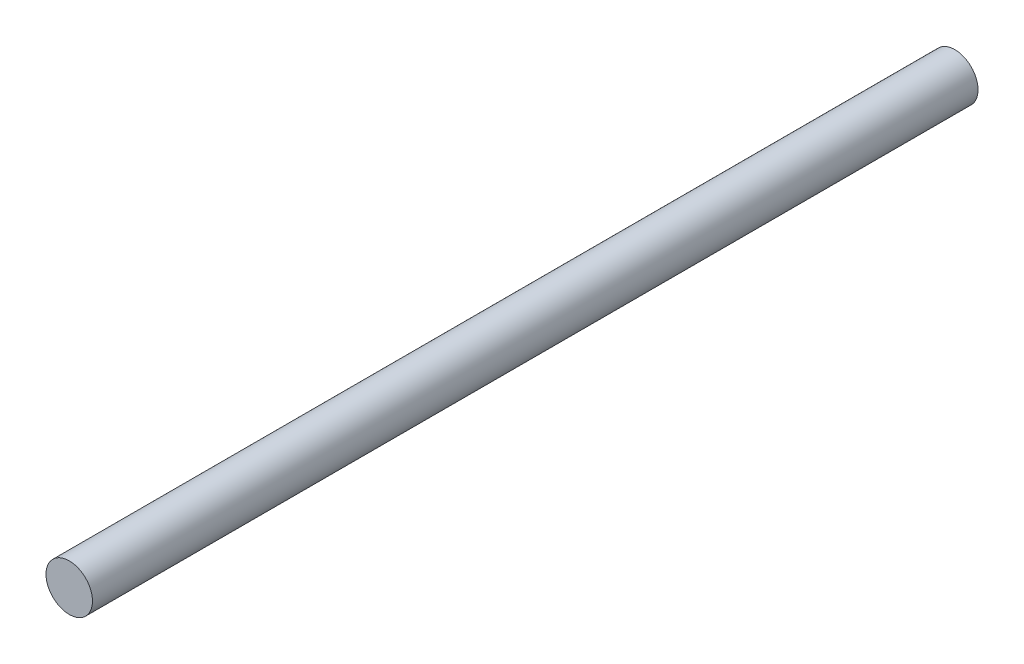
ISO-10303-21;
HEADER;
FILE_DESCRIPTION(('STEP AP214'),'2;1');
FILE_NAME('part.step','',(''),(''),'','','');
FILE_SCHEMA(('AUTOMOTIVE_DESIGN { 1 0 10303 214 1 1 1 1 }'));
ENDSEC;
DATA;
#1=APPLICATION_CONTEXT('core data for automotive mechanical design processes');
#2=APPLICATION_PROTOCOL_DEFINITION('international standard','automotive_design',2000,#1);
#3=PRODUCT_CONTEXT('',#1,'mechanical');
#4=PRODUCT('Part','Part','',(#3));
#5=PRODUCT_RELATED_PRODUCT_CATEGORY('part','',(#4));
#6=PRODUCT_DEFINITION_FORMATION('','',#4);
#7=PRODUCT_DEFINITION_CONTEXT('part definition',#1,'design');
#8=PRODUCT_DEFINITION('design','',#6,#7);
#9=PRODUCT_DEFINITION_SHAPE('','',#8);
#10=(LENGTH_UNIT() NAMED_UNIT(*) SI_UNIT(.MILLI.,.METRE.));
#11=(NAMED_UNIT(*) PLANE_ANGLE_UNIT() SI_UNIT($,.RADIAN.));
#12=(NAMED_UNIT(*) SI_UNIT($,.STERADIAN.) SOLID_ANGLE_UNIT());
#13=UNCERTAINTY_MEASURE_WITH_UNIT(LENGTH_MEASURE(1.E-05),#10,'distance_accuracy_value','');
#14=(GEOMETRIC_REPRESENTATION_CONTEXT(3) GLOBAL_UNCERTAINTY_ASSIGNED_CONTEXT((#13)) GLOBAL_UNIT_ASSIGNED_CONTEXT((#10,
#11,#12)) REPRESENTATION_CONTEXT('',''));
#15=CARTESIAN_POINT('',(0.,0.,0.));
#16=DIRECTION('',(0.,0.,1.));
#17=DIRECTION('',(1.,0.,0.));
#18=AXIS2_PLACEMENT_3D('',#15,#16,#17);
#19=CARTESIAN_POINT('',(0.,0.,76.2));
#20=DIRECTION('',(0.,0.,-1.));
#21=DIRECTION('',(-1.,0.,0.));
#22=AXIS2_PLACEMENT_3D('',#19,#20,#21);
#23=CYLINDRICAL_SURFACE('',#22,2.);
#24=CARTESIAN_POINT('',(0.,0.,76.2));
#25=DIRECTION('',(0.,0.,1.));
#26=DIRECTION('',(1.,0.,0.));
#27=AXIS2_PLACEMENT_3D('',#24,#25,#26);
#28=CIRCLE('',#27,2.);
#29=CARTESIAN_POINT('',(-2.,0.,76.2));
#30=VERTEX_POINT('',#29);
#31=EDGE_CURVE('E10',#30,#30,#28,.T.);
#32=CARTESIAN_POINT('',(0.,0.,0.));
#33=DIRECTION('',(0.,0.,1.));
#34=DIRECTION('',(1.,0.,0.));
#35=AXIS2_PLACEMENT_3D('',#32,#33,#34);
#36=CIRCLE('',#35,2.);
#37=CARTESIAN_POINT('',(-2.,0.,0.));
#38=VERTEX_POINT('',#37);
#39=EDGE_CURVE('E34',#38,#38,#36,.T.);
#40=CARTESIAN_POINT('',(-2.,0.,76.2));
#41=CARTESIAN_POINT('',(-2.,0.,75.40625));
#42=CARTESIAN_POINT('',(-2.,0.,74.6125));
#43=CARTESIAN_POINT('',(-2.,0.,73.025));
#44=CARTESIAN_POINT('',(-2.,0.,72.23125));
#45=CARTESIAN_POINT('',(-2.,0.,70.64375));
#46=CARTESIAN_POINT('',(-2.,0.,69.85));
#47=CARTESIAN_POINT('',(-2.,0.,68.2625));
#48=CARTESIAN_POINT('',(-2.,0.,67.46875));
#49=CARTESIAN_POINT('',(-2.,0.,65.88125));
#50=CARTESIAN_POINT('',(-2.,0.,65.0875));
#51=CARTESIAN_POINT('',(-2.,0.,63.5));
#52=CARTESIAN_POINT('',(-2.,0.,62.70625));
#53=CARTESIAN_POINT('',(-2.,0.,61.11875));
#54=CARTESIAN_POINT('',(-2.,0.,60.325));
#55=CARTESIAN_POINT('',(-2.,0.,58.7375));
#56=CARTESIAN_POINT('',(-2.,0.,57.94375));
#57=CARTESIAN_POINT('',(-2.,0.,56.35625));
#58=CARTESIAN_POINT('',(-2.,0.,55.5625));
#59=CARTESIAN_POINT('',(-2.,0.,53.975));
#60=CARTESIAN_POINT('',(-2.,0.,53.18125));
#61=CARTESIAN_POINT('',(-2.,0.,51.59375));
#62=CARTESIAN_POINT('',(-2.,0.,50.8));
#63=CARTESIAN_POINT('',(-2.,0.,49.2125));
#64=CARTESIAN_POINT('',(-2.,0.,48.41875));
#65=CARTESIAN_POINT('',(-2.,0.,46.83125));
#66=CARTESIAN_POINT('',(-2.,0.,46.0375));
#67=CARTESIAN_POINT('',(-2.,0.,44.45));
#68=CARTESIAN_POINT('',(-2.,0.,43.65625));
#69=CARTESIAN_POINT('',(-2.,0.,42.06875));
#70=CARTESIAN_POINT('',(-2.,0.,41.275));
#71=CARTESIAN_POINT('',(-2.,0.,39.6875));
#72=CARTESIAN_POINT('',(-2.,0.,38.89375));
#73=CARTESIAN_POINT('',(-2.,0.,37.30625));
#74=CARTESIAN_POINT('',(-2.,0.,36.5125));
#75=CARTESIAN_POINT('',(-2.,0.,34.925));
#76=CARTESIAN_POINT('',(-2.,0.,34.13125));
#77=CARTESIAN_POINT('',(-2.,0.,32.54375));
#78=CARTESIAN_POINT('',(-2.,0.,31.75));
#79=CARTESIAN_POINT('',(-2.,0.,30.1625));
#80=CARTESIAN_POINT('',(-2.,0.,29.36875));
#81=CARTESIAN_POINT('',(-2.,0.,27.78125));
#82=CARTESIAN_POINT('',(-2.,0.,26.9875));
#83=CARTESIAN_POINT('',(-2.,0.,25.4));
#84=CARTESIAN_POINT('',(-2.,0.,24.60625));
#85=CARTESIAN_POINT('',(-2.,0.,23.01875));
#86=CARTESIAN_POINT('',(-2.,0.,22.225));
#87=CARTESIAN_POINT('',(-2.,0.,20.6375));
#88=CARTESIAN_POINT('',(-2.,0.,19.84375));
#89=CARTESIAN_POINT('',(-2.,0.,18.25625));
#90=CARTESIAN_POINT('',(-2.,0.,17.4625));
#91=CARTESIAN_POINT('',(-2.,0.,15.875));
#92=CARTESIAN_POINT('',(-2.,0.,15.08125));
#93=CARTESIAN_POINT('',(-2.,0.,13.49375));
#94=CARTESIAN_POINT('',(-2.,0.,12.7));
#95=CARTESIAN_POINT('',(-2.,0.,11.1125));
#96=CARTESIAN_POINT('',(-2.,0.,10.31875));
#97=CARTESIAN_POINT('',(-2.,0.,8.73125));
#98=CARTESIAN_POINT('',(-2.,0.,7.93750000000001));
#99=CARTESIAN_POINT('',(-2.,0.,6.35));
#100=CARTESIAN_POINT('',(-2.,0.,5.55625));
#101=CARTESIAN_POINT('',(-2.,0.,3.96875));
#102=CARTESIAN_POINT('',(-2.,0.,3.175));
#103=CARTESIAN_POINT('',(-2.,0.,1.5875));
#104=CARTESIAN_POINT('',(-2.,0.,0.793750000000001));
#105=CARTESIAN_POINT('',(-2.,0.,0.));
#106=B_SPLINE_CURVE_WITH_KNOTS('',3,(#40,#41,#42,#43,#44,#45,#46,#47,#48,#49,#50,#51,#52,#53,
#54,#55,#56,#57,#58,#59,#60,#61,#62,#63,#64,#65,#66,#67,#68,#69,#70,#71,#72,#73,#74,#75,#76,#77,
#78,#79,#80,#81,#82,#83,#84,#85,#86,#87,#88,#89,#90,#91,#92,#93,#94,#95,#96,#97,#98,#99,#100,
#101,#102,#103,#104,#105),.UNSPECIFIED.,.F.,.F.,(4,2,2,2,2,2,2,2,2,2,2,2,2,2,2,2,2,2,2,2,2,2,2,
2,2,2,2,2,2,2,2,2,4),(0.,2.38125,4.7625,7.14375,9.52500000000001,11.90625,14.2875,16.66875,
19.05,21.43125,23.8125,26.19375,28.575,30.95625,33.3375,35.71875,38.1,40.48125,42.8625,45.24375,
47.625,50.00625,52.3875,54.76875,57.15,59.53125,61.9125,64.29375,66.675,69.05625,71.4375,
73.81875,76.2),.UNSPECIFIED.);
#107=EDGE_CURVE('BSEAM31',#30,#38,#106,.T.);
#108=ORIENTED_EDGE('',*,*,#31,.F.);
#109=ORIENTED_EDGE('',*,*,#39,.T.);
#110=ORIENTED_EDGE('',*,*,#107,.T.);
#111=ORIENTED_EDGE('',*,*,#107,.F.);
#112=EDGE_LOOP('',(#108,#110,#109,#111));
#113=FACE_BOUND('',#112,.T.);
#114=ADVANCED_FACE('F31',(#113),#23,.T.);
#115=CARTESIAN_POINT('',(0.,0.,76.2));
#116=DIRECTION('',(0.,0.,1.));
#117=DIRECTION('',(1.,0.,0.));
#118=AXIS2_PLACEMENT_3D('',#115,#116,#117);
#119=PLANE('',#118);
#120=ORIENTED_EDGE('',*,*,#31,.T.);
#121=EDGE_LOOP('',(#120));
#122=FACE_BOUND('',#121,.T.);
#123=ADVANCED_FACE('F46',(#122),#119,.T.);
#124=CARTESIAN_POINT('',(0.,0.,0.));
#125=DIRECTION('',(0.,0.,1.));
#126=DIRECTION('',(1.,0.,0.));
#127=AXIS2_PLACEMENT_3D('',#124,#125,#126);
#128=PLANE('',#127);
#129=ORIENTED_EDGE('',*,*,#39,.F.);
#130=EDGE_LOOP('',(#129));
#131=FACE_BOUND('',#130,.T.);
#132=ADVANCED_FACE('F44',(#131),#128,.F.);
#133=CLOSED_SHELL('',(#114,#123,#132));
#134=MANIFOLD_SOLID_BREP('B2',#133);
#135=ADVANCED_BREP_SHAPE_REPRESENTATION('',(#18,#134),#14);
#136=SHAPE_DEFINITION_REPRESENTATION(#9,#135);
ENDSEC;
END-ISO-10303-21;
